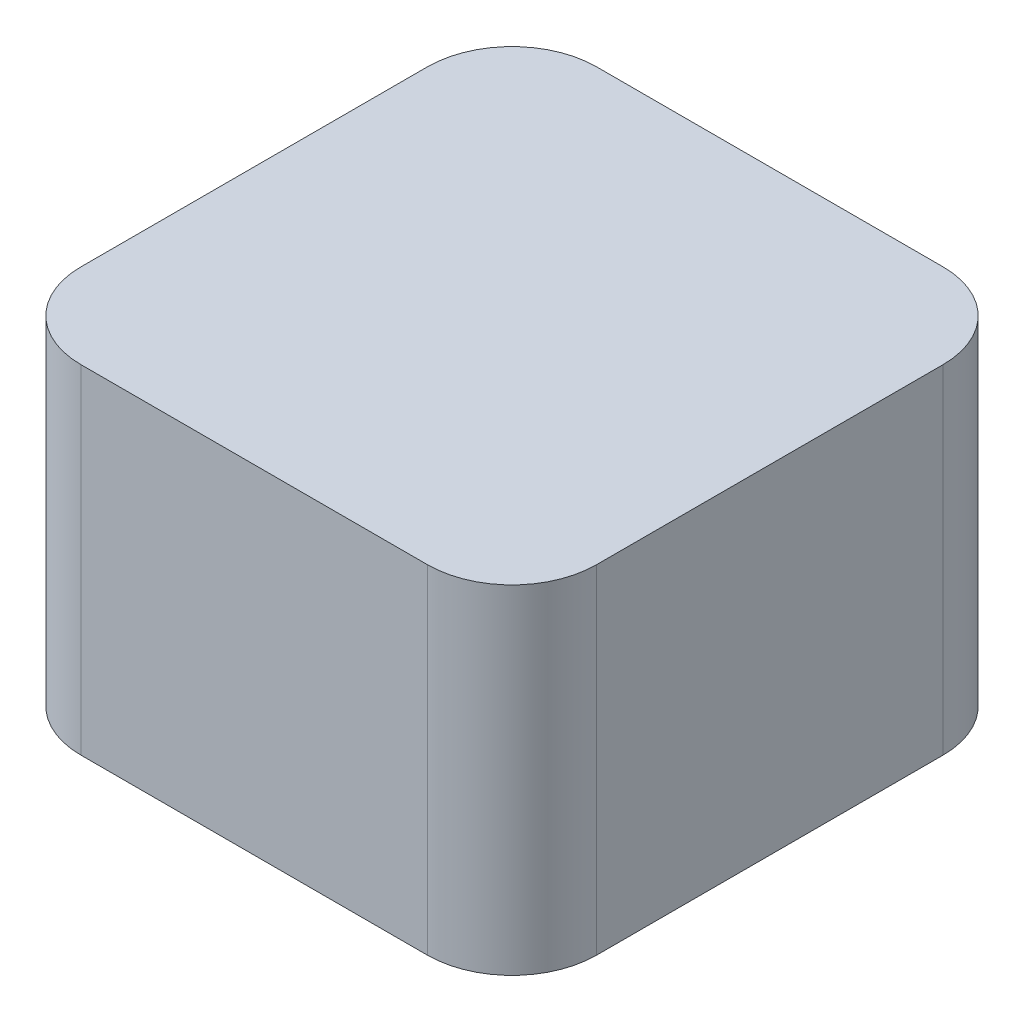
ISO-10303-21;
HEADER;
FILE_DESCRIPTION(('STEP AP214'),'2;1');
FILE_NAME('part.step','',(''),(''),'','','');
FILE_SCHEMA(('AUTOMOTIVE_DESIGN { 1 0 10303 214 1 1 1 1 }'));
ENDSEC;
DATA;
#1=APPLICATION_CONTEXT('core data for automotive mechanical design processes');
#2=APPLICATION_PROTOCOL_DEFINITION('international standard','automotive_design',2000,#1);
#3=PRODUCT_CONTEXT('',#1,'mechanical');
#4=PRODUCT('Part','Part','',(#3));
#5=PRODUCT_RELATED_PRODUCT_CATEGORY('part','',(#4));
#6=PRODUCT_DEFINITION_FORMATION('','',#4);
#7=PRODUCT_DEFINITION_CONTEXT('part definition',#1,'design');
#8=PRODUCT_DEFINITION('design','',#6,#7);
#9=PRODUCT_DEFINITION_SHAPE('','',#8);
#10=(LENGTH_UNIT() NAMED_UNIT(*) SI_UNIT(.MILLI.,.METRE.));
#11=(NAMED_UNIT(*) PLANE_ANGLE_UNIT() SI_UNIT($,.RADIAN.));
#12=(NAMED_UNIT(*) SI_UNIT($,.STERADIAN.) SOLID_ANGLE_UNIT());
#13=UNCERTAINTY_MEASURE_WITH_UNIT(LENGTH_MEASURE(1.E-05),#10,'distance_accuracy_value','');
#14=(GEOMETRIC_REPRESENTATION_CONTEXT(3) GLOBAL_UNCERTAINTY_ASSIGNED_CONTEXT((#13)) GLOBAL_UNIT_ASSIGNED_CONTEXT((#10,
#11,#12)) REPRESENTATION_CONTEXT('',''));
#15=CARTESIAN_POINT('',(0.,0.,0.));
#16=DIRECTION('',(0.,0.,1.));
#17=DIRECTION('',(1.,0.,0.));
#18=AXIS2_PLACEMENT_3D('',#15,#16,#17);
#19=CARTESIAN_POINT('',(4.1,8.,-4.1));
#20=DIRECTION('',(0.,-1.,0.));
#21=DIRECTION('',(0.,0.,-1.));
#22=AXIS2_PLACEMENT_3D('',#19,#20,#21);
#23=CYLINDRICAL_SURFACE('',#22,2.);
#24=CARTESIAN_POINT('',(4.1,0.,-4.1));
#25=DIRECTION('',(0.,1.,0.));
#26=DIRECTION('',(0.,0.,-1.));
#27=AXIS2_PLACEMENT_3D('',#24,#25,#26);
#28=CIRCLE('',#27,2.);
#29=CARTESIAN_POINT('',(6.1,0.,-4.09999999999999));
#30=VERTEX_POINT('',#29);
#31=CARTESIAN_POINT('',(4.09999999999999,0.,-6.1));
#32=VERTEX_POINT('',#31);
#33=EDGE_CURVE('E129',#30,#32,#28,.T.);
#34=ORIENTED_EDGE('',*,*,#33,.T.);
#35=DIRECTION('',(0.,-1.,0.));
#36=VECTOR('',#35,1.);
#37=CARTESIAN_POINT('',(4.09999999999999,8.,-6.1));
#38=LINE('',#37,#36);
#39=CARTESIAN_POINT('',(4.09999999999999,8.,-6.1));
#40=VERTEX_POINT('',#39);
#41=EDGE_CURVE('E11',#40,#32,#38,.T.);
#42=ORIENTED_EDGE('',*,*,#41,.F.);
#43=CARTESIAN_POINT('',(4.1,8.,-4.1));
#44=DIRECTION('',(0.,1.,0.));
#45=DIRECTION('',(0.,0.,-1.));
#46=AXIS2_PLACEMENT_3D('',#43,#44,#45);
#47=CIRCLE('',#46,2.);
#48=CARTESIAN_POINT('',(6.1,8.,-4.09999999999999));
#49=VERTEX_POINT('',#48);
#50=EDGE_CURVE('E143',#49,#40,#47,.T.);
#51=ORIENTED_EDGE('',*,*,#50,.F.);
#52=DIRECTION('',(0.,-1.,0.));
#53=VECTOR('',#52,1.);
#54=CARTESIAN_POINT('',(6.1,8.,-4.09999999999999));
#55=LINE('',#54,#53);
#56=EDGE_CURVE('E125',#49,#30,#55,.T.);
#57=ORIENTED_EDGE('',*,*,#56,.T.);
#58=EDGE_LOOP('',(#34,#42,#51,#57));
#59=FACE_BOUND('',#58,.T.);
#60=ADVANCED_FACE('F33',(#59),#23,.T.);
#61=CARTESIAN_POINT('',(-4.09999999999999,8.,-6.1));
#62=DIRECTION('',(0.,0.,1.));
#63=DIRECTION('',(1.,0.,0.));
#64=AXIS2_PLACEMENT_3D('',#61,#62,#63);
#65=PLANE('',#64);
#66=DIRECTION('',(-1.,0.,0.));
#67=VECTOR('',#66,1.);
#68=CARTESIAN_POINT('',(-4.09999999999999,0.,-6.1));
#69=LINE('',#68,#67);
#70=CARTESIAN_POINT('',(-4.09999999999999,0.,-6.1));
#71=VERTEX_POINT('',#70);
#72=EDGE_CURVE('E132',#32,#71,#69,.T.);
#73=ORIENTED_EDGE('',*,*,#72,.T.);
#74=DIRECTION('',(0.,-1.,0.));
#75=VECTOR('',#74,1.);
#76=CARTESIAN_POINT('',(-4.09999999999999,8.,-6.1));
#77=LINE('',#76,#75);
#78=CARTESIAN_POINT('',(-4.09999999999999,8.,-6.1));
#79=VERTEX_POINT('',#78);
#80=EDGE_CURVE('E41',#79,#71,#77,.T.);
#81=ORIENTED_EDGE('',*,*,#80,.F.);
#82=DIRECTION('',(-1.,0.,0.));
#83=VECTOR('',#82,1.);
#84=CARTESIAN_POINT('',(-4.09999999999999,8.,-6.1));
#85=LINE('',#84,#83);
#86=EDGE_CURVE('E92',#40,#79,#85,.T.);
#87=ORIENTED_EDGE('',*,*,#86,.F.);
#88=ORIENTED_EDGE('',*,*,#41,.T.);
#89=EDGE_LOOP('',(#73,#81,#87,#88));
#90=FACE_BOUND('',#89,.T.);
#91=ADVANCED_FACE('F178',(#90),#65,.F.);
#92=CARTESIAN_POINT('',(-4.1,8.,-4.1));
#93=DIRECTION('',(0.,-1.,0.));
#94=DIRECTION('',(0.,0.,-1.));
#95=AXIS2_PLACEMENT_3D('',#92,#93,#94);
#96=CYLINDRICAL_SURFACE('',#95,2.);
#97=CARTESIAN_POINT('',(-4.1,0.,-4.1));
#98=DIRECTION('',(0.,1.,0.));
#99=DIRECTION('',(0.,0.,-1.));
#100=AXIS2_PLACEMENT_3D('',#97,#98,#99);
#101=CIRCLE('',#100,2.);
#102=CARTESIAN_POINT('',(-6.1,0.,-4.09999999999998));
#103=VERTEX_POINT('',#102);
#104=EDGE_CURVE('E134',#71,#103,#101,.T.);
#105=ORIENTED_EDGE('',*,*,#104,.T.);
#106=DIRECTION('',(0.,-1.,0.));
#107=VECTOR('',#106,1.);
#108=CARTESIAN_POINT('',(-6.1,8.,-4.09999999999998));
#109=LINE('',#108,#107);
#110=CARTESIAN_POINT('',(-6.1,8.,-4.09999999999998));
#111=VERTEX_POINT('',#110);
#112=EDGE_CURVE('E150',#111,#103,#109,.T.);
#113=ORIENTED_EDGE('',*,*,#112,.F.);
#114=CARTESIAN_POINT('',(-4.1,8.,-4.1));
#115=DIRECTION('',(0.,1.,0.));
#116=DIRECTION('',(0.,0.,-1.));
#117=AXIS2_PLACEMENT_3D('',#114,#115,#116);
#118=CIRCLE('',#117,2.);
#119=EDGE_CURVE('E158',#79,#111,#118,.T.);
#120=ORIENTED_EDGE('',*,*,#119,.F.);
#121=ORIENTED_EDGE('',*,*,#80,.T.);
#122=EDGE_LOOP('',(#105,#113,#120,#121));
#123=FACE_BOUND('',#122,.T.);
#124=ADVANCED_FACE('F156',(#123),#96,.T.);
#125=CARTESIAN_POINT('',(-6.1,8.,-4.09999999999999));
#126=DIRECTION('',(1.,0.,0.));
#127=DIRECTION('',(0.,0.,-1.));
#128=AXIS2_PLACEMENT_3D('',#125,#126,#127);
#129=PLANE('',#128);
#130=DIRECTION('',(0.,0.,1.));
#131=VECTOR('',#130,1.);
#132=CARTESIAN_POINT('',(-6.1,0.,-4.09999999999999));
#133=LINE('',#132,#131);
#134=CARTESIAN_POINT('',(-6.1,0.,4.09999999999999));
#135=VERTEX_POINT('',#134);
#136=EDGE_CURVE('E136',#103,#135,#133,.T.);
#137=ORIENTED_EDGE('',*,*,#136,.T.);
#138=DIRECTION('',(0.,-1.,0.));
#139=VECTOR('',#138,1.);
#140=CARTESIAN_POINT('',(-6.1,8.,4.09999999999999));
#141=LINE('',#140,#139);
#142=CARTESIAN_POINT('',(-6.1,8.,4.09999999999999));
#143=VERTEX_POINT('',#142);
#144=EDGE_CURVE('E147',#143,#135,#141,.T.);
#145=ORIENTED_EDGE('',*,*,#144,.F.);
#146=DIRECTION('',(0.,0.,1.));
#147=VECTOR('',#146,1.);
#148=CARTESIAN_POINT('',(-6.1,8.,-4.09999999999999));
#149=LINE('',#148,#147);
#150=EDGE_CURVE('E170',#111,#143,#149,.T.);
#151=ORIENTED_EDGE('',*,*,#150,.F.);
#152=ORIENTED_EDGE('',*,*,#112,.T.);
#153=EDGE_LOOP('',(#137,#145,#151,#152));
#154=FACE_BOUND('',#153,.T.);
#155=ADVANCED_FACE('F166',(#154),#129,.F.);
#156=CARTESIAN_POINT('',(-4.1,8.,4.1));
#157=DIRECTION('',(0.,-1.,0.));
#158=DIRECTION('',(0.,0.,-1.));
#159=AXIS2_PLACEMENT_3D('',#156,#157,#158);
#160=CYLINDRICAL_SURFACE('',#159,2.);
#161=CARTESIAN_POINT('',(-4.1,0.,4.1));
#162=DIRECTION('',(0.,1.,0.));
#163=DIRECTION('',(0.,0.,-1.));
#164=AXIS2_PLACEMENT_3D('',#161,#162,#163);
#165=CIRCLE('',#164,2.);
#166=CARTESIAN_POINT('',(-4.09999999999999,0.,6.1));
#167=VERTEX_POINT('',#166);
#168=EDGE_CURVE('E138',#135,#167,#165,.T.);
#169=ORIENTED_EDGE('',*,*,#168,.T.);
#170=DIRECTION('',(0.,-1.,0.));
#171=VECTOR('',#170,1.);
#172=CARTESIAN_POINT('',(-4.09999999999999,8.,6.1));
#173=LINE('',#172,#171);
#174=CARTESIAN_POINT('',(-4.09999999999999,8.,6.1));
#175=VERTEX_POINT('',#174);
#176=EDGE_CURVE('E120',#175,#167,#173,.T.);
#177=ORIENTED_EDGE('',*,*,#176,.F.);
#178=CARTESIAN_POINT('',(-4.1,8.,4.1));
#179=DIRECTION('',(0.,1.,0.));
#180=DIRECTION('',(0.,0.,-1.));
#181=AXIS2_PLACEMENT_3D('',#178,#179,#180);
#182=CIRCLE('',#181,2.);
#183=EDGE_CURVE('E111',#143,#175,#182,.T.);
#184=ORIENTED_EDGE('',*,*,#183,.F.);
#185=ORIENTED_EDGE('',*,*,#144,.T.);
#186=EDGE_LOOP('',(#169,#177,#184,#185));
#187=FACE_BOUND('',#186,.T.);
#188=ADVANCED_FACE('F169',(#187),#160,.T.);
#189=CARTESIAN_POINT('',(-4.09999999999999,8.,6.1));
#190=DIRECTION('',(0.,0.,-1.));
#191=DIRECTION('',(-1.,0.,0.));
#192=AXIS2_PLACEMENT_3D('',#189,#190,#191);
#193=PLANE('',#192);
#194=DIRECTION('',(1.,0.,0.));
#195=VECTOR('',#194,1.);
#196=CARTESIAN_POINT('',(-4.09999999999999,0.,6.1));
#197=LINE('',#196,#195);
#198=CARTESIAN_POINT('',(4.09999999999999,0.,6.1));
#199=VERTEX_POINT('',#198);
#200=EDGE_CURVE('E119',#167,#199,#197,.T.);
#201=ORIENTED_EDGE('',*,*,#200,.T.);
#202=DIRECTION('',(0.,-1.,0.));
#203=VECTOR('',#202,1.);
#204=CARTESIAN_POINT('',(4.09999999999999,8.,6.1));
#205=LINE('',#204,#203);
#206=CARTESIAN_POINT('',(4.09999999999999,8.,6.1));
#207=VERTEX_POINT('',#206);
#208=EDGE_CURVE('E116',#207,#199,#205,.T.);
#209=ORIENTED_EDGE('',*,*,#208,.F.);
#210=DIRECTION('',(1.,0.,0.));
#211=VECTOR('',#210,1.);
#212=CARTESIAN_POINT('',(-4.09999999999999,8.,6.1));
#213=LINE('',#212,#211);
#214=EDGE_CURVE('E105',#175,#207,#213,.T.);
#215=ORIENTED_EDGE('',*,*,#214,.F.);
#216=ORIENTED_EDGE('',*,*,#176,.T.);
#217=EDGE_LOOP('',(#201,#209,#215,#216));
#218=FACE_BOUND('',#217,.T.);
#219=ADVANCED_FACE('F117',(#218),#193,.F.);
#220=CARTESIAN_POINT('',(4.1,8.,4.1));
#221=DIRECTION('',(0.,-1.,0.));
#222=DIRECTION('',(0.,0.,-1.));
#223=AXIS2_PLACEMENT_3D('',#220,#221,#222);
#224=CYLINDRICAL_SURFACE('',#223,2.);
#225=CARTESIAN_POINT('',(4.1,0.,4.1));
#226=DIRECTION('',(0.,1.,0.));
#227=DIRECTION('',(0.,0.,-1.));
#228=AXIS2_PLACEMENT_3D('',#225,#226,#227);
#229=CIRCLE('',#228,2.);
#230=CARTESIAN_POINT('',(6.1,0.,4.09999999999999));
#231=VERTEX_POINT('',#230);
#232=EDGE_CURVE('E78',#199,#231,#229,.T.);
#233=ORIENTED_EDGE('',*,*,#232,.T.);
#234=DIRECTION('',(0.,-1.,0.));
#235=VECTOR('',#234,1.);
#236=CARTESIAN_POINT('',(6.1,8.,4.09999999999999));
#237=LINE('',#236,#235);
#238=CARTESIAN_POINT('',(6.1,8.,4.09999999999999));
#239=VERTEX_POINT('',#238);
#240=EDGE_CURVE('E121',#239,#231,#237,.T.);
#241=ORIENTED_EDGE('',*,*,#240,.F.);
#242=CARTESIAN_POINT('',(4.1,8.,4.1));
#243=DIRECTION('',(0.,1.,0.));
#244=DIRECTION('',(0.,0.,-1.));
#245=AXIS2_PLACEMENT_3D('',#242,#243,#244);
#246=CIRCLE('',#245,2.);
#247=EDGE_CURVE('E109',#207,#239,#246,.T.);
#248=ORIENTED_EDGE('',*,*,#247,.F.);
#249=ORIENTED_EDGE('',*,*,#208,.T.);
#250=EDGE_LOOP('',(#233,#241,#248,#249));
#251=FACE_BOUND('',#250,.T.);
#252=ADVANCED_FACE('F123',(#251),#224,.T.);
#253=CARTESIAN_POINT('',(6.1,8.,-4.09999999999999));
#254=DIRECTION('',(-1.,0.,0.));
#255=DIRECTION('',(0.,0.,1.));
#256=AXIS2_PLACEMENT_3D('',#253,#254,#255);
#257=PLANE('',#256);
#258=DIRECTION('',(0.,0.,-1.));
#259=VECTOR('',#258,1.);
#260=CARTESIAN_POINT('',(6.1,0.,-4.09999999999999));
#261=LINE('',#260,#259);
#262=EDGE_CURVE('E84',#231,#30,#261,.T.);
#263=ORIENTED_EDGE('',*,*,#262,.T.);
#264=ORIENTED_EDGE('',*,*,#56,.F.);
#265=DIRECTION('',(0.,0.,-1.));
#266=VECTOR('',#265,1.);
#267=CARTESIAN_POINT('',(6.1,8.,-4.09999999999999));
#268=LINE('',#267,#266);
#269=EDGE_CURVE('E49',#239,#49,#268,.T.);
#270=ORIENTED_EDGE('',*,*,#269,.F.);
#271=ORIENTED_EDGE('',*,*,#240,.T.);
#272=EDGE_LOOP('',(#263,#264,#270,#271));
#273=FACE_BOUND('',#272,.T.);
#274=ADVANCED_FACE('F194',(#273),#257,.F.);
#275=CARTESIAN_POINT('',(4.1,8.,-4.1));
#276=DIRECTION('',(0.,-1.,0.));
#277=DIRECTION('',(0.,0.,-1.));
#278=AXIS2_PLACEMENT_3D('',#275,#276,#277);
#279=PLANE('',#278);
#280=ORIENTED_EDGE('',*,*,#50,.T.);
#281=ORIENTED_EDGE('',*,*,#86,.T.);
#282=ORIENTED_EDGE('',*,*,#119,.T.);
#283=ORIENTED_EDGE('',*,*,#150,.T.);
#284=ORIENTED_EDGE('',*,*,#183,.T.);
#285=ORIENTED_EDGE('',*,*,#214,.T.);
#286=ORIENTED_EDGE('',*,*,#247,.T.);
#287=ORIENTED_EDGE('',*,*,#269,.T.);
#288=EDGE_LOOP('',(#280,#281,#282,#283,#284,#285,#286,#287));
#289=FACE_BOUND('',#288,.T.);
#290=ADVANCED_FACE('F107',(#289),#279,.F.);
#291=CARTESIAN_POINT('',(4.1,0.,-4.1));
#292=DIRECTION('',(0.,-1.,0.));
#293=DIRECTION('',(0.,0.,-1.));
#294=AXIS2_PLACEMENT_3D('',#291,#292,#293);
#295=PLANE('',#294);
#296=ORIENTED_EDGE('',*,*,#33,.F.);
#297=ORIENTED_EDGE('',*,*,#262,.F.);
#298=ORIENTED_EDGE('',*,*,#232,.F.);
#299=ORIENTED_EDGE('',*,*,#200,.F.);
#300=ORIENTED_EDGE('',*,*,#168,.F.);
#301=ORIENTED_EDGE('',*,*,#136,.F.);
#302=ORIENTED_EDGE('',*,*,#104,.F.);
#303=ORIENTED_EDGE('',*,*,#72,.F.);
#304=EDGE_LOOP('',(#296,#297,#298,#299,#300,#301,#302,#303));
#305=FACE_BOUND('',#304,.T.);
#306=ADVANCED_FACE('F162',(#305),#295,.T.);
#307=CLOSED_SHELL('',(#60,#91,#124,#155,#188,#219,#252,#274,#290,#306));
#308=MANIFOLD_SOLID_BREP('B2',#307);
#309=ADVANCED_BREP_SHAPE_REPRESENTATION('',(#18,#308),#14);
#310=SHAPE_DEFINITION_REPRESENTATION(#9,#309);
ENDSEC;
END-ISO-10303-21;
